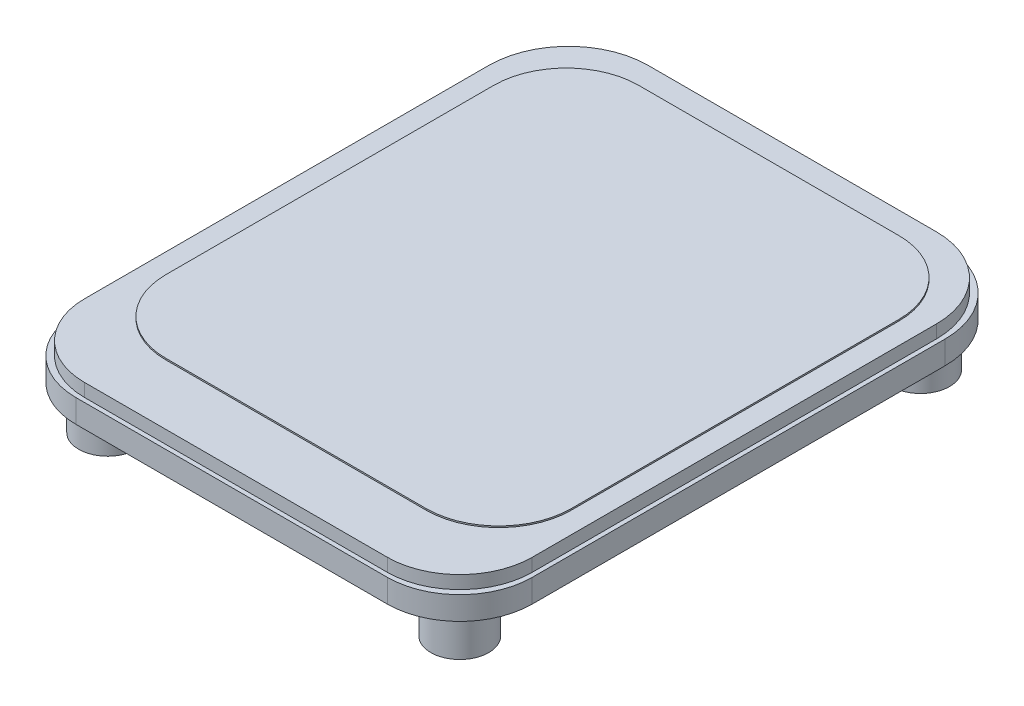
ISO-10303-21;
HEADER;
FILE_DESCRIPTION(('STEP AP214'),'2;1');
FILE_NAME('part.step','',(''),(''),'','','');
FILE_SCHEMA(('AUTOMOTIVE_DESIGN { 1 0 10303 214 1 1 1 1 }'));
ENDSEC;
DATA;
#1=APPLICATION_CONTEXT('core data for automotive mechanical design processes');
#2=APPLICATION_PROTOCOL_DEFINITION('international standard','automotive_design',2000,#1);
#3=PRODUCT_CONTEXT('',#1,'mechanical');
#4=PRODUCT('Part','Part','',(#3));
#5=PRODUCT_RELATED_PRODUCT_CATEGORY('part','',(#4));
#6=PRODUCT_DEFINITION_FORMATION('','',#4);
#7=PRODUCT_DEFINITION_CONTEXT('part definition',#1,'design');
#8=PRODUCT_DEFINITION('design','',#6,#7);
#9=PRODUCT_DEFINITION_SHAPE('','',#8);
#10=(LENGTH_UNIT() NAMED_UNIT(*) SI_UNIT(.MILLI.,.METRE.));
#11=(NAMED_UNIT(*) PLANE_ANGLE_UNIT() SI_UNIT($,.RADIAN.));
#12=(NAMED_UNIT(*) SI_UNIT($,.STERADIAN.) SOLID_ANGLE_UNIT());
#13=UNCERTAINTY_MEASURE_WITH_UNIT(LENGTH_MEASURE(1.E-05),#10,'distance_accuracy_value','');
#14=(GEOMETRIC_REPRESENTATION_CONTEXT(3) GLOBAL_UNCERTAINTY_ASSIGNED_CONTEXT((#13)) GLOBAL_UNIT_ASSIGNED_CONTEXT((#10,
#11,#12)) REPRESENTATION_CONTEXT('',''));
#15=CARTESIAN_POINT('',(0.,0.,0.));
#16=DIRECTION('',(0.,0.,1.));
#17=DIRECTION('',(1.,0.,0.));
#18=AXIS2_PLACEMENT_3D('',#15,#16,#17);
#19=CARTESIAN_POINT('',(10.25,1.6,-14.));
#20=DIRECTION('',(0.,-1.,0.));
#21=DIRECTION('',(0.,0.,-1.));
#22=AXIS2_PLACEMENT_3D('',#19,#20,#21);
#23=PLANE('',#22);
#24=CARTESIAN_POINT('',(10.25,1.6,-14.));
#25=DIRECTION('',(0.,1.,0.));
#26=DIRECTION('',(0.,0.,-1.));
#27=AXIS2_PLACEMENT_3D('',#24,#25,#26);
#28=CIRCLE('',#27,5.5);
#29=CARTESIAN_POINT('',(15.75,1.6,-14.));
#30=VERTEX_POINT('',#29);
#31=CARTESIAN_POINT('',(10.25,1.6,-19.5));
#32=VERTEX_POINT('',#31);
#33=EDGE_CURVE('E288',#30,#32,#28,.T.);
#34=ORIENTED_EDGE('',*,*,#33,.T.);
#35=DIRECTION('',(-1.,0.,0.));
#36=VECTOR('',#35,1.);
#37=CARTESIAN_POINT('',(-10.25,1.6,-19.5));
#38=LINE('',#37,#36);
#39=CARTESIAN_POINT('',(-10.25,1.6,-19.5));
#40=VERTEX_POINT('',#39);
#41=EDGE_CURVE('E291',#32,#40,#38,.T.);
#42=ORIENTED_EDGE('',*,*,#41,.T.);
#43=CARTESIAN_POINT('',(-10.25,1.6,-14.));
#44=DIRECTION('',(0.,1.,0.));
#45=DIRECTION('',(0.,0.,1.));
#46=AXIS2_PLACEMENT_3D('',#43,#44,#45);
#47=CIRCLE('',#46,5.5);
#48=CARTESIAN_POINT('',(-15.75,1.6,-14.));
#49=VERTEX_POINT('',#48);
#50=EDGE_CURVE('E294',#40,#49,#47,.T.);
#51=ORIENTED_EDGE('',*,*,#50,.T.);
#52=DIRECTION('',(0.,0.,1.));
#53=VECTOR('',#52,1.);
#54=CARTESIAN_POINT('',(-15.75,1.6,-14.));
#55=LINE('',#54,#53);
#56=CARTESIAN_POINT('',(-15.75,1.6,14.5));
#57=VERTEX_POINT('',#56);
#58=EDGE_CURVE('E296',#49,#57,#55,.T.);
#59=ORIENTED_EDGE('',*,*,#58,.T.);
#60=CARTESIAN_POINT('',(-10.75,1.6,14.5));
#61=DIRECTION('',(0.,1.,0.));
#62=DIRECTION('',(0.,0.,1.));
#63=AXIS2_PLACEMENT_3D('',#60,#61,#62);
#64=CIRCLE('',#63,5.);
#65=CARTESIAN_POINT('',(-10.75,1.6,19.5));
#66=VERTEX_POINT('',#65);
#67=EDGE_CURVE('E298',#57,#66,#64,.T.);
#68=ORIENTED_EDGE('',*,*,#67,.T.);
#69=DIRECTION('',(1.,0.,0.));
#70=VECTOR('',#69,1.);
#71=CARTESIAN_POINT('',(-10.75,1.6,19.5));
#72=LINE('',#71,#70);
#73=CARTESIAN_POINT('',(10.75,1.6,19.5));
#74=VERTEX_POINT('',#73);
#75=EDGE_CURVE('E300',#66,#74,#72,.T.);
#76=ORIENTED_EDGE('',*,*,#75,.T.);
#77=CARTESIAN_POINT('',(10.75,1.6,14.5));
#78=DIRECTION('',(0.,1.,0.));
#79=DIRECTION('',(0.,0.,1.));
#80=AXIS2_PLACEMENT_3D('',#77,#78,#79);
#81=CIRCLE('',#80,5.);
#82=CARTESIAN_POINT('',(15.75,1.6,14.5));
#83=VERTEX_POINT('',#82);
#84=EDGE_CURVE('E302',#74,#83,#81,.T.);
#85=ORIENTED_EDGE('',*,*,#84,.T.);
#86=DIRECTION('',(0.,0.,-1.));
#87=VECTOR('',#86,1.);
#88=CARTESIAN_POINT('',(15.75,1.6,-14.));
#89=LINE('',#88,#87);
#90=EDGE_CURVE('E304',#83,#30,#89,.T.);
#91=ORIENTED_EDGE('',*,*,#90,.T.);
#92=EDGE_LOOP('',(#34,#42,#51,#59,#68,#76,#85,#91));
#93=FACE_BOUND('',#92,.T.);
#94=CARTESIAN_POINT('',(10.45,1.6,14.2));
#95=DIRECTION('',(0.,1.,0.));
#96=DIRECTION('',(0.,0.,1.));
#97=AXIS2_PLACEMENT_3D('',#94,#95,#96);
#98=CIRCLE('',#97,5.);
#99=CARTESIAN_POINT('',(10.45,1.6,19.2));
#100=VERTEX_POINT('',#99);
#101=CARTESIAN_POINT('',(15.45,1.6,14.2));
#102=VERTEX_POINT('',#101);
#103=EDGE_CURVE('E219',#100,#102,#98,.T.);
#104=ORIENTED_EDGE('',*,*,#103,.F.);
#105=DIRECTION('',(1.,0.,0.));
#106=VECTOR('',#105,1.);
#107=CARTESIAN_POINT('',(-10.45,1.6,19.2));
#108=LINE('',#107,#106);
#109=CARTESIAN_POINT('',(-10.45,1.6,19.2));
#110=VERTEX_POINT('',#109);
#111=EDGE_CURVE('E216',#110,#100,#108,.T.);
#112=ORIENTED_EDGE('',*,*,#111,.F.);
#113=CARTESIAN_POINT('',(-10.45,1.6,14.2));
#114=DIRECTION('',(0.,1.,0.));
#115=DIRECTION('',(0.,0.,1.));
#116=AXIS2_PLACEMENT_3D('',#113,#114,#115);
#117=CIRCLE('',#116,5.);
#118=CARTESIAN_POINT('',(-15.45,1.6,14.2));
#119=VERTEX_POINT('',#118);
#120=EDGE_CURVE('E559',#119,#110,#117,.T.);
#121=ORIENTED_EDGE('',*,*,#120,.F.);
#122=DIRECTION('',(0.,0.,1.));
#123=VECTOR('',#122,1.);
#124=CARTESIAN_POINT('',(-15.45,1.6,-13.7));
#125=LINE('',#124,#123);
#126=CARTESIAN_POINT('',(-15.45,1.6,-13.7));
#127=VERTEX_POINT('',#126);
#128=EDGE_CURVE('E556',#127,#119,#125,.T.);
#129=ORIENTED_EDGE('',*,*,#128,.F.);
#130=CARTESIAN_POINT('',(-9.95,1.6,-13.7));
#131=DIRECTION('',(0.,1.,0.));
#132=DIRECTION('',(0.,0.,1.));
#133=AXIS2_PLACEMENT_3D('',#130,#131,#132);
#134=CIRCLE('',#133,5.5);
#135=CARTESIAN_POINT('',(-9.95,1.6,-19.2));
#136=VERTEX_POINT('',#135);
#137=EDGE_CURVE('E553',#136,#127,#134,.T.);
#138=ORIENTED_EDGE('',*,*,#137,.F.);
#139=DIRECTION('',(-1.,0.,0.));
#140=VECTOR('',#139,1.);
#141=CARTESIAN_POINT('',(-9.94999999999997,1.6,-19.2));
#142=LINE('',#141,#140);
#143=CARTESIAN_POINT('',(9.94999999999996,1.6,-19.2));
#144=VERTEX_POINT('',#143);
#145=EDGE_CURVE('E550',#144,#136,#142,.T.);
#146=ORIENTED_EDGE('',*,*,#145,.F.);
#147=CARTESIAN_POINT('',(9.95,1.6,-13.7));
#148=DIRECTION('',(0.,1.,0.));
#149=DIRECTION('',(0.,0.,-1.));
#150=AXIS2_PLACEMENT_3D('',#147,#148,#149);
#151=CIRCLE('',#150,5.5);
#152=CARTESIAN_POINT('',(15.45,1.6,-13.7));
#153=VERTEX_POINT('',#152);
#154=EDGE_CURVE('E57',#153,#144,#151,.T.);
#155=ORIENTED_EDGE('',*,*,#154,.F.);
#156=DIRECTION('',(0.,0.,-1.));
#157=VECTOR('',#156,1.);
#158=CARTESIAN_POINT('',(15.45,1.6,-13.7));
#159=LINE('',#158,#157);
#160=EDGE_CURVE('E52',#102,#153,#159,.T.);
#161=ORIENTED_EDGE('',*,*,#160,.F.);
#162=EDGE_LOOP('',(#104,#112,#121,#129,#138,#146,#155,#161));
#163=FACE_BOUND('',#162,.T.);
#164=ADVANCED_FACE('F37',(#93,#163),#23,.F.);
#165=CARTESIAN_POINT('',(10.25,1.6,-14.));
#166=DIRECTION('',(0.,-1.,0.));
#167=DIRECTION('',(0.,0.,-1.));
#168=AXIS2_PLACEMENT_3D('',#165,#166,#167);
#169=CYLINDRICAL_SURFACE('',#168,5.5);
#170=CARTESIAN_POINT('',(10.25,0.,-14.));
#171=DIRECTION('',(0.,1.,0.));
#172=DIRECTION('',(0.,0.,-1.));
#173=AXIS2_PLACEMENT_3D('',#170,#171,#172);
#174=CIRCLE('',#173,5.5);
#175=CARTESIAN_POINT('',(15.75,0.,-14.));
#176=VERTEX_POINT('',#175);
#177=CARTESIAN_POINT('',(10.25,0.,-19.5));
#178=VERTEX_POINT('',#177);
#179=EDGE_CURVE('E287',#176,#178,#174,.T.);
#180=ORIENTED_EDGE('',*,*,#179,.T.);
#181=DIRECTION('',(0.,-1.,0.));
#182=VECTOR('',#181,1.);
#183=CARTESIAN_POINT('',(10.25,1.6,-19.5));
#184=LINE('',#183,#182);
#185=EDGE_CURVE('E342',#32,#178,#184,.T.);
#186=ORIENTED_EDGE('',*,*,#185,.F.);
#187=ORIENTED_EDGE('',*,*,#33,.F.);
#188=DIRECTION('',(0.,-1.,0.));
#189=VECTOR('',#188,1.);
#190=CARTESIAN_POINT('',(15.75,1.6,-14.));
#191=LINE('',#190,#189);
#192=EDGE_CURVE('E306',#30,#176,#191,.T.);
#193=ORIENTED_EDGE('',*,*,#192,.T.);
#194=EDGE_LOOP('',(#180,#186,#187,#193));
#195=FACE_BOUND('',#194,.T.);
#196=ADVANCED_FACE('F39',(#195),#169,.T.);
#197=CARTESIAN_POINT('',(-10.25,1.6,-19.5));
#198=DIRECTION('',(0.,0.,1.));
#199=DIRECTION('',(1.,0.,0.));
#200=AXIS2_PLACEMENT_3D('',#197,#198,#199);
#201=PLANE('',#200);
#202=DIRECTION('',(-1.,0.,0.));
#203=VECTOR('',#202,1.);
#204=CARTESIAN_POINT('',(-10.25,0.,-19.5));
#205=LINE('',#204,#203);
#206=CARTESIAN_POINT('',(-10.25,0.,-19.5));
#207=VERTEX_POINT('',#206);
#208=EDGE_CURVE('E309',#178,#207,#205,.T.);
#209=ORIENTED_EDGE('',*,*,#208,.T.);
#210=DIRECTION('',(0.,-1.,0.));
#211=VECTOR('',#210,1.);
#212=CARTESIAN_POINT('',(-10.25,1.6,-19.5));
#213=LINE('',#212,#211);
#214=EDGE_CURVE('E339',#40,#207,#213,.T.);
#215=ORIENTED_EDGE('',*,*,#214,.F.);
#216=ORIENTED_EDGE('',*,*,#41,.F.);
#217=ORIENTED_EDGE('',*,*,#185,.T.);
#218=EDGE_LOOP('',(#209,#215,#216,#217));
#219=FACE_BOUND('',#218,.T.);
#220=ADVANCED_FACE('F390',(#219),#201,.F.);
#221=CARTESIAN_POINT('',(-10.25,1.6,-14.));
#222=DIRECTION('',(0.,-1.,0.));
#223=DIRECTION('',(0.,0.,-1.));
#224=AXIS2_PLACEMENT_3D('',#221,#222,#223);
#225=CYLINDRICAL_SURFACE('',#224,5.5);
#226=CARTESIAN_POINT('',(-10.25,0.,-14.));
#227=DIRECTION('',(0.,1.,0.));
#228=DIRECTION('',(0.,0.,1.));
#229=AXIS2_PLACEMENT_3D('',#226,#227,#228);
#230=CIRCLE('',#229,5.5);
#231=CARTESIAN_POINT('',(-15.75,0.,-14.));
#232=VERTEX_POINT('',#231);
#233=EDGE_CURVE('E311',#207,#232,#230,.T.);
#234=ORIENTED_EDGE('',*,*,#233,.T.);
#235=DIRECTION('',(0.,-1.,0.));
#236=VECTOR('',#235,1.);
#237=CARTESIAN_POINT('',(-15.75,1.6,-14.));
#238=LINE('',#237,#236);
#239=EDGE_CURVE('E336',#49,#232,#238,.T.);
#240=ORIENTED_EDGE('',*,*,#239,.F.);
#241=ORIENTED_EDGE('',*,*,#50,.F.);
#242=ORIENTED_EDGE('',*,*,#214,.T.);
#243=EDGE_LOOP('',(#234,#240,#241,#242));
#244=FACE_BOUND('',#243,.T.);
#245=ADVANCED_FACE('F623',(#244),#225,.T.);
#246=CARTESIAN_POINT('',(-15.75,1.6,-14.));
#247=DIRECTION('',(1.,0.,0.));
#248=DIRECTION('',(0.,0.,-1.));
#249=AXIS2_PLACEMENT_3D('',#246,#247,#248);
#250=PLANE('',#249);
#251=DIRECTION('',(0.,0.,1.));
#252=VECTOR('',#251,1.);
#253=CARTESIAN_POINT('',(-15.75,0.,-14.));
#254=LINE('',#253,#252);
#255=CARTESIAN_POINT('',(-15.75,0.,14.5));
#256=VERTEX_POINT('',#255);
#257=EDGE_CURVE('E313',#232,#256,#254,.T.);
#258=ORIENTED_EDGE('',*,*,#257,.T.);
#259=DIRECTION('',(0.,-1.,0.));
#260=VECTOR('',#259,1.);
#261=CARTESIAN_POINT('',(-15.75,1.6,14.5));
#262=LINE('',#261,#260);
#263=EDGE_CURVE('E333',#57,#256,#262,.T.);
#264=ORIENTED_EDGE('',*,*,#263,.F.);
#265=ORIENTED_EDGE('',*,*,#58,.F.);
#266=ORIENTED_EDGE('',*,*,#239,.T.);
#267=EDGE_LOOP('',(#258,#264,#265,#266));
#268=FACE_BOUND('',#267,.T.);
#269=ADVANCED_FACE('F620',(#268),#250,.F.);
#270=CARTESIAN_POINT('',(-10.75,1.6,14.5));
#271=DIRECTION('',(0.,-1.,0.));
#272=DIRECTION('',(0.,0.,-1.));
#273=AXIS2_PLACEMENT_3D('',#270,#271,#272);
#274=CYLINDRICAL_SURFACE('',#273,5.);
#275=CARTESIAN_POINT('',(-10.75,0.,14.5));
#276=DIRECTION('',(0.,1.,0.));
#277=DIRECTION('',(0.,0.,1.));
#278=AXIS2_PLACEMENT_3D('',#275,#276,#277);
#279=CIRCLE('',#278,5.);
#280=CARTESIAN_POINT('',(-10.75,0.,19.5));
#281=VERTEX_POINT('',#280);
#282=EDGE_CURVE('E315',#256,#281,#279,.T.);
#283=ORIENTED_EDGE('',*,*,#282,.T.);
#284=DIRECTION('',(0.,-1.,0.));
#285=VECTOR('',#284,1.);
#286=CARTESIAN_POINT('',(-10.75,1.6,19.5));
#287=LINE('',#286,#285);
#288=EDGE_CURVE('E330',#66,#281,#287,.T.);
#289=ORIENTED_EDGE('',*,*,#288,.F.);
#290=ORIENTED_EDGE('',*,*,#67,.F.);
#291=ORIENTED_EDGE('',*,*,#263,.T.);
#292=EDGE_LOOP('',(#283,#289,#290,#291));
#293=FACE_BOUND('',#292,.T.);
#294=ADVANCED_FACE('F616',(#293),#274,.T.);
#295=CARTESIAN_POINT('',(-10.75,1.6,19.5));
#296=DIRECTION('',(0.,0.,-1.));
#297=DIRECTION('',(-1.,0.,0.));
#298=AXIS2_PLACEMENT_3D('',#295,#296,#297);
#299=PLANE('',#298);
#300=DIRECTION('',(1.,0.,0.));
#301=VECTOR('',#300,1.);
#302=CARTESIAN_POINT('',(-10.75,0.,19.5));
#303=LINE('',#302,#301);
#304=CARTESIAN_POINT('',(10.75,0.,19.5));
#305=VERTEX_POINT('',#304);
#306=EDGE_CURVE('E317',#281,#305,#303,.T.);
#307=ORIENTED_EDGE('',*,*,#306,.T.);
#308=DIRECTION('',(0.,-1.,0.));
#309=VECTOR('',#308,1.);
#310=CARTESIAN_POINT('',(10.75,1.6,19.5));
#311=LINE('',#310,#309);
#312=EDGE_CURVE('E327',#74,#305,#311,.T.);
#313=ORIENTED_EDGE('',*,*,#312,.F.);
#314=ORIENTED_EDGE('',*,*,#75,.F.);
#315=ORIENTED_EDGE('',*,*,#288,.T.);
#316=EDGE_LOOP('',(#307,#313,#314,#315));
#317=FACE_BOUND('',#316,.T.);
#318=ADVANCED_FACE('F611',(#317),#299,.F.);
#319=CARTESIAN_POINT('',(10.75,1.6,14.5));
#320=DIRECTION('',(0.,-1.,0.));
#321=DIRECTION('',(0.,0.,-1.));
#322=AXIS2_PLACEMENT_3D('',#319,#320,#321);
#323=CYLINDRICAL_SURFACE('',#322,5.);
#324=CARTESIAN_POINT('',(10.75,0.,14.5));
#325=DIRECTION('',(0.,1.,0.));
#326=DIRECTION('',(0.,0.,1.));
#327=AXIS2_PLACEMENT_3D('',#324,#325,#326);
#328=CIRCLE('',#327,5.);
#329=CARTESIAN_POINT('',(15.75,0.,14.5));
#330=VERTEX_POINT('',#329);
#331=EDGE_CURVE('E319',#305,#330,#328,.T.);
#332=ORIENTED_EDGE('',*,*,#331,.T.);
#333=DIRECTION('',(0.,-1.,0.));
#334=VECTOR('',#333,1.);
#335=CARTESIAN_POINT('',(15.75,1.6,14.5));
#336=LINE('',#335,#334);
#337=EDGE_CURVE('E324',#83,#330,#336,.T.);
#338=ORIENTED_EDGE('',*,*,#337,.F.);
#339=ORIENTED_EDGE('',*,*,#84,.F.);
#340=ORIENTED_EDGE('',*,*,#312,.T.);
#341=EDGE_LOOP('',(#332,#338,#339,#340));
#342=FACE_BOUND('',#341,.T.);
#343=ADVANCED_FACE('F605',(#342),#323,.T.);
#344=CARTESIAN_POINT('',(15.75,1.6,-14.));
#345=DIRECTION('',(-1.,0.,0.));
#346=DIRECTION('',(0.,0.,1.));
#347=AXIS2_PLACEMENT_3D('',#344,#345,#346);
#348=PLANE('',#347);
#349=DIRECTION('',(0.,0.,-1.));
#350=VECTOR('',#349,1.);
#351=CARTESIAN_POINT('',(15.75,0.,-14.));
#352=LINE('',#351,#350);
#353=EDGE_CURVE('E292',#330,#176,#352,.T.);
#354=ORIENTED_EDGE('',*,*,#353,.T.);
#355=ORIENTED_EDGE('',*,*,#192,.F.);
#356=ORIENTED_EDGE('',*,*,#90,.F.);
#357=ORIENTED_EDGE('',*,*,#337,.T.);
#358=EDGE_LOOP('',(#354,#355,#356,#357));
#359=FACE_BOUND('',#358,.T.);
#360=ADVANCED_FACE('F591',(#359),#348,.F.);
#361=CARTESIAN_POINT('',(10.25,0.,-14.));
#362=DIRECTION('',(0.,-1.,0.));
#363=DIRECTION('',(0.,0.,-1.));
#364=AXIS2_PLACEMENT_3D('',#361,#362,#363);
#365=PLANE('',#364);
#366=CARTESIAN_POINT('',(-12.15,0.,-15.9));
#367=DIRECTION('',(0.,-1.,0.));
#368=DIRECTION('',(0.,0.,-1.));
#369=AXIS2_PLACEMENT_3D('',#366,#367,#368);
#370=CIRCLE('',#369,2.);
#371=CARTESIAN_POINT('',(-12.15,0.,-17.9));
#372=VERTEX_POINT('',#371);
#373=EDGE_CURVE('E501',#372,#372,#370,.T.);
#374=ORIENTED_EDGE('',*,*,#373,.F.);
#375=EDGE_LOOP('',(#374));
#376=FACE_BOUND('',#375,.T.);
#377=CARTESIAN_POINT('',(12.15,0.,-15.9));
#378=DIRECTION('',(0.,-1.,0.));
#379=DIRECTION('',(0.,0.,-1.));
#380=AXIS2_PLACEMENT_3D('',#377,#378,#379);
#381=CIRCLE('',#380,2.);
#382=CARTESIAN_POINT('',(12.15,0.,-17.9));
#383=VERTEX_POINT('',#382);
#384=EDGE_CURVE('E512',#383,#383,#381,.T.);
#385=ORIENTED_EDGE('',*,*,#384,.F.);
#386=EDGE_LOOP('',(#385));
#387=FACE_BOUND('',#386,.T.);
#388=CARTESIAN_POINT('',(12.15,0.,15.9));
#389=DIRECTION('',(0.,-1.,0.));
#390=DIRECTION('',(0.,0.,-1.));
#391=AXIS2_PLACEMENT_3D('',#388,#389,#390);
#392=CIRCLE('',#391,2.);
#393=CARTESIAN_POINT('',(12.15,0.,13.9));
#394=VERTEX_POINT('',#393);
#395=EDGE_CURVE('E521',#394,#394,#392,.T.);
#396=ORIENTED_EDGE('',*,*,#395,.F.);
#397=EDGE_LOOP('',(#396));
#398=FACE_BOUND('',#397,.T.);
#399=CARTESIAN_POINT('',(-12.15,0.,15.9));
#400=DIRECTION('',(0.,-1.,0.));
#401=DIRECTION('',(0.,0.,-1.));
#402=AXIS2_PLACEMENT_3D('',#399,#400,#401);
#403=CIRCLE('',#402,2.);
#404=CARTESIAN_POINT('',(-12.15,0.,13.9));
#405=VERTEX_POINT('',#404);
#406=EDGE_CURVE('E530',#405,#405,#403,.T.);
#407=ORIENTED_EDGE('',*,*,#406,.F.);
#408=EDGE_LOOP('',(#407));
#409=FACE_BOUND('',#408,.T.);
#410=ORIENTED_EDGE('',*,*,#179,.F.);
#411=ORIENTED_EDGE('',*,*,#353,.F.);
#412=ORIENTED_EDGE('',*,*,#331,.F.);
#413=ORIENTED_EDGE('',*,*,#306,.F.);
#414=ORIENTED_EDGE('',*,*,#282,.F.);
#415=ORIENTED_EDGE('',*,*,#257,.F.);
#416=ORIENTED_EDGE('',*,*,#233,.F.);
#417=ORIENTED_EDGE('',*,*,#208,.F.);
#418=EDGE_LOOP('',(#410,#411,#412,#413,#414,#415,#416,#417));
#419=FACE_BOUND('',#418,.T.);
#420=ADVANCED_FACE('F374',(#376,#387,#398,#409,#419),#365,.T.);
#421=CARTESIAN_POINT('',(10.45,2.5,14.2));
#422=DIRECTION('',(0.,1.,0.));
#423=DIRECTION('',(0.,0.,1.));
#424=AXIS2_PLACEMENT_3D('',#421,#422,#423);
#425=PLANE('',#424);
#426=CARTESIAN_POINT('',(10.45,2.5,14.2));
#427=DIRECTION('',(0.,1.,0.));
#428=DIRECTION('',(0.,0.,1.));
#429=AXIS2_PLACEMENT_3D('',#426,#427,#428);
#430=CIRCLE('',#429,5.);
#431=CARTESIAN_POINT('',(10.45,2.5,19.2));
#432=VERTEX_POINT('',#431);
#433=CARTESIAN_POINT('',(15.45,2.5,14.2));
#434=VERTEX_POINT('',#433);
#435=EDGE_CURVE('E206',#432,#434,#430,.T.);
#436=ORIENTED_EDGE('',*,*,#435,.T.);
#437=DIRECTION('',(0.,0.,-1.));
#438=VECTOR('',#437,1.);
#439=CARTESIAN_POINT('',(15.45,2.5,-13.7));
#440=LINE('',#439,#438);
#441=CARTESIAN_POINT('',(15.45,2.5,-13.7));
#442=VERTEX_POINT('',#441);
#443=EDGE_CURVE('E195',#434,#442,#440,.T.);
#444=ORIENTED_EDGE('',*,*,#443,.T.);
#445=CARTESIAN_POINT('',(9.95,2.5,-13.7));
#446=DIRECTION('',(0.,1.,0.));
#447=DIRECTION('',(0.,0.,-1.));
#448=AXIS2_PLACEMENT_3D('',#445,#446,#447);
#449=CIRCLE('',#448,5.5);
#450=CARTESIAN_POINT('',(9.94999999999996,2.5,-19.2));
#451=VERTEX_POINT('',#450);
#452=EDGE_CURVE('E205',#442,#451,#449,.T.);
#453=ORIENTED_EDGE('',*,*,#452,.T.);
#454=DIRECTION('',(-1.,0.,0.));
#455=VECTOR('',#454,1.);
#456=CARTESIAN_POINT('',(-9.94999999999997,2.5,-19.2));
#457=LINE('',#456,#455);
#458=CARTESIAN_POINT('',(-9.94999999999997,2.5,-19.2));
#459=VERTEX_POINT('',#458);
#460=EDGE_CURVE('E537',#451,#459,#457,.T.);
#461=ORIENTED_EDGE('',*,*,#460,.T.);
#462=CARTESIAN_POINT('',(-9.95,2.5,-13.7));
#463=DIRECTION('',(0.,1.,0.));
#464=DIRECTION('',(0.,0.,1.));
#465=AXIS2_PLACEMENT_3D('',#462,#463,#464);
#466=CIRCLE('',#465,5.5);
#467=CARTESIAN_POINT('',(-15.45,2.5,-13.7));
#468=VERTEX_POINT('',#467);
#469=EDGE_CURVE('E539',#459,#468,#466,.T.);
#470=ORIENTED_EDGE('',*,*,#469,.T.);
#471=DIRECTION('',(0.,0.,1.));
#472=VECTOR('',#471,1.);
#473=CARTESIAN_POINT('',(-15.45,2.5,-13.7));
#474=LINE('',#473,#472);
#475=CARTESIAN_POINT('',(-15.45,2.5,14.2));
#476=VERTEX_POINT('',#475);
#477=EDGE_CURVE('E541',#468,#476,#474,.T.);
#478=ORIENTED_EDGE('',*,*,#477,.T.);
#479=CARTESIAN_POINT('',(-10.45,2.5,14.2));
#480=DIRECTION('',(0.,1.,0.));
#481=DIRECTION('',(0.,0.,1.));
#482=AXIS2_PLACEMENT_3D('',#479,#480,#481);
#483=CIRCLE('',#482,5.);
#484=CARTESIAN_POINT('',(-10.45,2.5,19.2));
#485=VERTEX_POINT('',#484);
#486=EDGE_CURVE('E543',#476,#485,#483,.T.);
#487=ORIENTED_EDGE('',*,*,#486,.T.);
#488=DIRECTION('',(1.,0.,0.));
#489=VECTOR('',#488,1.);
#490=CARTESIAN_POINT('',(-10.45,2.5,19.2));
#491=LINE('',#490,#489);
#492=EDGE_CURVE('E212',#485,#432,#491,.T.);
#493=ORIENTED_EDGE('',*,*,#492,.T.);
#494=EDGE_LOOP('',(#436,#444,#453,#461,#470,#478,#487,#493));
#495=FACE_BOUND('',#494,.T.);
#496=CARTESIAN_POINT('',(-8.98499999999999,2.5,10.05));
#497=DIRECTION('',(0.,1.,0.));
#498=DIRECTION('',(0.,0.,1.));
#499=AXIS2_PLACEMENT_3D('',#496,#497,#498);
#500=CIRCLE('',#499,5.);
#501=CARTESIAN_POINT('',(-13.985,2.5,10.05));
#502=VERTEX_POINT('',#501);
#503=CARTESIAN_POINT('',(-8.98499999999999,2.5,15.05));
#504=VERTEX_POINT('',#503);
#505=EDGE_CURVE('E243',#502,#504,#500,.T.);
#506=ORIENTED_EDGE('',*,*,#505,.F.);
#507=DIRECTION('',(0.,0.,1.));
#508=VECTOR('',#507,1.);
#509=CARTESIAN_POINT('',(-13.985,2.5,-12.58));
#510=LINE('',#509,#508);
#511=CARTESIAN_POINT('',(-13.985,2.5,-12.58));
#512=VERTEX_POINT('',#511);
#513=EDGE_CURVE('E345',#512,#502,#510,.T.);
#514=ORIENTED_EDGE('',*,*,#513,.F.);
#515=CARTESIAN_POINT('',(-8.985,2.5,-12.58));
#516=DIRECTION('',(0.,1.,0.));
#517=DIRECTION('',(0.,0.,1.));
#518=AXIS2_PLACEMENT_3D('',#515,#516,#517);
#519=CIRCLE('',#518,5.);
#520=CARTESIAN_POINT('',(-8.985,2.5,-17.58));
#521=VERTEX_POINT('',#520);
#522=EDGE_CURVE('E220',#521,#512,#519,.T.);
#523=ORIENTED_EDGE('',*,*,#522,.F.);
#524=DIRECTION('',(-1.,0.,0.));
#525=VECTOR('',#524,1.);
#526=CARTESIAN_POINT('',(-8.985,2.5,-17.58));
#527=LINE('',#526,#525);
#528=CARTESIAN_POINT('',(8.985,2.5,-17.58));
#529=VERTEX_POINT('',#528);
#530=EDGE_CURVE('E223',#529,#521,#527,.T.);
#531=ORIENTED_EDGE('',*,*,#530,.F.);
#532=CARTESIAN_POINT('',(8.985,2.5,-12.58));
#533=DIRECTION('',(0.,1.,0.));
#534=DIRECTION('',(0.,0.,1.));
#535=AXIS2_PLACEMENT_3D('',#532,#533,#534);
#536=CIRCLE('',#535,5.);
#537=CARTESIAN_POINT('',(13.985,2.5,-12.58));
#538=VERTEX_POINT('',#537);
#539=EDGE_CURVE('E231',#538,#529,#536,.T.);
#540=ORIENTED_EDGE('',*,*,#539,.F.);
#541=DIRECTION('',(0.,0.,-1.));
#542=VECTOR('',#541,1.);
#543=CARTESIAN_POINT('',(13.985,2.5,-12.58));
#544=LINE('',#543,#542);
#545=CARTESIAN_POINT('',(13.985,2.5,10.05));
#546=VERTEX_POINT('',#545);
#547=EDGE_CURVE('E234',#546,#538,#544,.T.);
#548=ORIENTED_EDGE('',*,*,#547,.F.);
#549=CARTESIAN_POINT('',(8.985,2.5,10.05));
#550=DIRECTION('',(0.,1.,0.));
#551=DIRECTION('',(0.,0.,1.));
#552=AXIS2_PLACEMENT_3D('',#549,#550,#551);
#553=CIRCLE('',#552,5.);
#554=CARTESIAN_POINT('',(8.985,2.5,15.05));
#555=VERTEX_POINT('',#554);
#556=EDGE_CURVE('E237',#555,#546,#553,.T.);
#557=ORIENTED_EDGE('',*,*,#556,.F.);
#558=DIRECTION('',(1.,0.,0.));
#559=VECTOR('',#558,1.);
#560=CARTESIAN_POINT('',(-8.98499999999999,2.5,15.05));
#561=LINE('',#560,#559);
#562=EDGE_CURVE('E240',#504,#555,#561,.T.);
#563=ORIENTED_EDGE('',*,*,#562,.F.);
#564=EDGE_LOOP('',(#506,#514,#523,#531,#540,#548,#557,#563));
#565=FACE_BOUND('',#564,.T.);
#566=ADVANCED_FACE('F209',(#495,#565),#425,.T.);
#567=CARTESIAN_POINT('',(10.45,2.5,14.2));
#568=DIRECTION('',(0.,-1.,0.));
#569=DIRECTION('',(0.,0.,-1.));
#570=AXIS2_PLACEMENT_3D('',#567,#568,#569);
#571=CYLINDRICAL_SURFACE('',#570,5.);
#572=ORIENTED_EDGE('',*,*,#103,.T.);
#573=DIRECTION('',(0.,-1.,0.));
#574=VECTOR('',#573,1.);
#575=CARTESIAN_POINT('',(15.45,2.5,14.2));
#576=LINE('',#575,#574);
#577=EDGE_CURVE('E199',#434,#102,#576,.T.);
#578=ORIENTED_EDGE('',*,*,#577,.F.);
#579=ORIENTED_EDGE('',*,*,#435,.F.);
#580=DIRECTION('',(0.,-1.,0.));
#581=VECTOR('',#580,1.);
#582=CARTESIAN_POINT('',(10.45,2.5,19.2));
#583=LINE('',#582,#581);
#584=EDGE_CURVE('E546',#432,#100,#583,.T.);
#585=ORIENTED_EDGE('',*,*,#584,.T.);
#586=EDGE_LOOP('',(#572,#578,#579,#585));
#587=FACE_BOUND('',#586,.T.);
#588=ADVANCED_FACE('F218',(#587),#571,.T.);
#589=CARTESIAN_POINT('',(15.45,2.5,-13.7));
#590=DIRECTION('',(-1.,0.,0.));
#591=DIRECTION('',(0.,0.,1.));
#592=AXIS2_PLACEMENT_3D('',#589,#590,#591);
#593=PLANE('',#592);
#594=ORIENTED_EDGE('',*,*,#160,.T.);
#595=DIRECTION('',(0.,-1.,0.));
#596=VECTOR('',#595,1.);
#597=CARTESIAN_POINT('',(15.45,2.5,-13.7));
#598=LINE('',#597,#596);
#599=EDGE_CURVE('E202',#442,#153,#598,.T.);
#600=ORIENTED_EDGE('',*,*,#599,.F.);
#601=ORIENTED_EDGE('',*,*,#443,.F.);
#602=ORIENTED_EDGE('',*,*,#577,.T.);
#603=EDGE_LOOP('',(#594,#600,#601,#602));
#604=FACE_BOUND('',#603,.T.);
#605=ADVANCED_FACE('F197',(#604),#593,.F.);
#606=CARTESIAN_POINT('',(9.95,2.5,-13.7));
#607=DIRECTION('',(0.,-1.,0.));
#608=DIRECTION('',(0.,0.,-1.));
#609=AXIS2_PLACEMENT_3D('',#606,#607,#608);
#610=CYLINDRICAL_SURFACE('',#609,5.5);
#611=ORIENTED_EDGE('',*,*,#154,.T.);
#612=DIRECTION('',(0.,-1.,0.));
#613=VECTOR('',#612,1.);
#614=CARTESIAN_POINT('',(9.94999999999996,2.5,-19.2));
#615=LINE('',#614,#613);
#616=EDGE_CURVE('E225',#451,#144,#615,.T.);
#617=ORIENTED_EDGE('',*,*,#616,.F.);
#618=ORIENTED_EDGE('',*,*,#452,.F.);
#619=ORIENTED_EDGE('',*,*,#599,.T.);
#620=EDGE_LOOP('',(#611,#617,#618,#619));
#621=FACE_BOUND('',#620,.T.);
#622=ADVANCED_FACE('F435',(#621),#610,.T.);
#623=CARTESIAN_POINT('',(-9.94999999999997,2.5,-19.2));
#624=DIRECTION('',(0.,0.,1.));
#625=DIRECTION('',(1.,0.,0.));
#626=AXIS2_PLACEMENT_3D('',#623,#624,#625);
#627=PLANE('',#626);
#628=ORIENTED_EDGE('',*,*,#145,.T.);
#629=DIRECTION('',(0.,-1.,0.));
#630=VECTOR('',#629,1.);
#631=CARTESIAN_POINT('',(-9.94999999999997,2.5,-19.2));
#632=LINE('',#631,#630);
#633=EDGE_CURVE('E574',#459,#136,#632,.T.);
#634=ORIENTED_EDGE('',*,*,#633,.F.);
#635=ORIENTED_EDGE('',*,*,#460,.F.);
#636=ORIENTED_EDGE('',*,*,#616,.T.);
#637=EDGE_LOOP('',(#628,#634,#635,#636));
#638=FACE_BOUND('',#637,.T.);
#639=ADVANCED_FACE('F438',(#638),#627,.F.);
#640=CARTESIAN_POINT('',(-9.95,2.5,-13.7));
#641=DIRECTION('',(0.,-1.,0.));
#642=DIRECTION('',(0.,0.,-1.));
#643=AXIS2_PLACEMENT_3D('',#640,#641,#642);
#644=CYLINDRICAL_SURFACE('',#643,5.5);
#645=ORIENTED_EDGE('',*,*,#137,.T.);
#646=DIRECTION('',(0.,-1.,0.));
#647=VECTOR('',#646,1.);
#648=CARTESIAN_POINT('',(-15.45,2.5,-13.7));
#649=LINE('',#648,#647);
#650=EDGE_CURVE('E571',#468,#127,#649,.T.);
#651=ORIENTED_EDGE('',*,*,#650,.F.);
#652=ORIENTED_EDGE('',*,*,#469,.F.);
#653=ORIENTED_EDGE('',*,*,#633,.T.);
#654=EDGE_LOOP('',(#645,#651,#652,#653));
#655=FACE_BOUND('',#654,.T.);
#656=ADVANCED_FACE('F442',(#655),#644,.T.);
#657=CARTESIAN_POINT('',(-15.45,2.5,-13.7));
#658=DIRECTION('',(1.,0.,0.));
#659=DIRECTION('',(0.,0.,-1.));
#660=AXIS2_PLACEMENT_3D('',#657,#658,#659);
#661=PLANE('',#660);
#662=ORIENTED_EDGE('',*,*,#128,.T.);
#663=DIRECTION('',(0.,-1.,0.));
#664=VECTOR('',#663,1.);
#665=CARTESIAN_POINT('',(-15.45,2.5,14.2));
#666=LINE('',#665,#664);
#667=EDGE_CURVE('E568',#476,#119,#666,.T.);
#668=ORIENTED_EDGE('',*,*,#667,.F.);
#669=ORIENTED_EDGE('',*,*,#477,.F.);
#670=ORIENTED_EDGE('',*,*,#650,.T.);
#671=EDGE_LOOP('',(#662,#668,#669,#670));
#672=FACE_BOUND('',#671,.T.);
#673=ADVANCED_FACE('F446',(#672),#661,.F.);
#674=CARTESIAN_POINT('',(-10.45,2.5,14.2));
#675=DIRECTION('',(0.,-1.,0.));
#676=DIRECTION('',(0.,0.,-1.));
#677=AXIS2_PLACEMENT_3D('',#674,#675,#676);
#678=CYLINDRICAL_SURFACE('',#677,5.);
#679=ORIENTED_EDGE('',*,*,#120,.T.);
#680=DIRECTION('',(0.,-1.,0.));
#681=VECTOR('',#680,1.);
#682=CARTESIAN_POINT('',(-10.45,2.5,19.2));
#683=LINE('',#682,#681);
#684=EDGE_CURVE('E565',#485,#110,#683,.T.);
#685=ORIENTED_EDGE('',*,*,#684,.F.);
#686=ORIENTED_EDGE('',*,*,#486,.F.);
#687=ORIENTED_EDGE('',*,*,#667,.T.);
#688=EDGE_LOOP('',(#679,#685,#686,#687));
#689=FACE_BOUND('',#688,.T.);
#690=ADVANCED_FACE('F450',(#689),#678,.T.);
#691=CARTESIAN_POINT('',(-10.45,2.5,19.2));
#692=DIRECTION('',(0.,0.,-1.));
#693=DIRECTION('',(-1.,0.,0.));
#694=AXIS2_PLACEMENT_3D('',#691,#692,#693);
#695=PLANE('',#694);
#696=ORIENTED_EDGE('',*,*,#111,.T.);
#697=ORIENTED_EDGE('',*,*,#584,.F.);
#698=ORIENTED_EDGE('',*,*,#492,.F.);
#699=ORIENTED_EDGE('',*,*,#684,.T.);
#700=EDGE_LOOP('',(#696,#697,#698,#699));
#701=FACE_BOUND('',#700,.T.);
#702=ADVANCED_FACE('F429',(#701),#695,.F.);
#703=CARTESIAN_POINT('',(-8.98499999999999,2.6,10.05));
#704=DIRECTION('',(0.,1.,0.));
#705=DIRECTION('',(0.,0.,1.));
#706=AXIS2_PLACEMENT_3D('',#703,#704,#705);
#707=PLANE('',#706);
#708=CARTESIAN_POINT('',(-8.98499999999999,2.6,10.05));
#709=DIRECTION('',(0.,1.,0.));
#710=DIRECTION('',(0.,0.,1.));
#711=AXIS2_PLACEMENT_3D('',#708,#709,#710);
#712=CIRCLE('',#711,5.);
#713=CARTESIAN_POINT('',(-13.985,2.6,10.05));
#714=VERTEX_POINT('',#713);
#715=CARTESIAN_POINT('',(-8.98499999999999,2.6,15.05));
#716=VERTEX_POINT('',#715);
#717=EDGE_CURVE('E246',#714,#716,#712,.T.);
#718=ORIENTED_EDGE('',*,*,#717,.T.);
#719=DIRECTION('',(1.,0.,0.));
#720=VECTOR('',#719,1.);
#721=CARTESIAN_POINT('',(-8.98499999999999,2.6,15.05));
#722=LINE('',#721,#720);
#723=CARTESIAN_POINT('',(8.985,2.6,15.05));
#724=VERTEX_POINT('',#723);
#725=EDGE_CURVE('E249',#716,#724,#722,.T.);
#726=ORIENTED_EDGE('',*,*,#725,.T.);
#727=CARTESIAN_POINT('',(8.985,2.6,10.05));
#728=DIRECTION('',(0.,1.,0.));
#729=DIRECTION('',(0.,0.,1.));
#730=AXIS2_PLACEMENT_3D('',#727,#728,#729);
#731=CIRCLE('',#730,5.);
#732=CARTESIAN_POINT('',(13.985,2.6,10.05));
#733=VERTEX_POINT('',#732);
#734=EDGE_CURVE('E251',#724,#733,#731,.T.);
#735=ORIENTED_EDGE('',*,*,#734,.T.);
#736=DIRECTION('',(0.,0.,-1.));
#737=VECTOR('',#736,1.);
#738=CARTESIAN_POINT('',(13.985,2.6,-12.58));
#739=LINE('',#738,#737);
#740=CARTESIAN_POINT('',(13.985,2.6,-12.58));
#741=VERTEX_POINT('',#740);
#742=EDGE_CURVE('E253',#733,#741,#739,.T.);
#743=ORIENTED_EDGE('',*,*,#742,.T.);
#744=CARTESIAN_POINT('',(8.985,2.6,-12.58));
#745=DIRECTION('',(0.,1.,0.));
#746=DIRECTION('',(0.,0.,-1.));
#747=AXIS2_PLACEMENT_3D('',#744,#745,#746);
#748=CIRCLE('',#747,5.);
#749=CARTESIAN_POINT('',(8.985,2.6,-17.58));
#750=VERTEX_POINT('',#749);
#751=EDGE_CURVE('E255',#741,#750,#748,.T.);
#752=ORIENTED_EDGE('',*,*,#751,.T.);
#753=DIRECTION('',(-1.,0.,0.));
#754=VECTOR('',#753,1.);
#755=CARTESIAN_POINT('',(-8.985,2.6,-17.58));
#756=LINE('',#755,#754);
#757=CARTESIAN_POINT('',(-8.985,2.6,-17.58));
#758=VERTEX_POINT('',#757);
#759=EDGE_CURVE('E257',#750,#758,#756,.T.);
#760=ORIENTED_EDGE('',*,*,#759,.T.);
#761=CARTESIAN_POINT('',(-8.985,2.6,-12.58));
#762=DIRECTION('',(0.,1.,0.));
#763=DIRECTION('',(0.,0.,1.));
#764=AXIS2_PLACEMENT_3D('',#761,#762,#763);
#765=CIRCLE('',#764,5.);
#766=CARTESIAN_POINT('',(-13.985,2.6,-12.58));
#767=VERTEX_POINT('',#766);
#768=EDGE_CURVE('E259',#758,#767,#765,.T.);
#769=ORIENTED_EDGE('',*,*,#768,.T.);
#770=DIRECTION('',(0.,0.,1.));
#771=VECTOR('',#770,1.);
#772=CARTESIAN_POINT('',(-13.985,2.6,-12.58));
#773=LINE('',#772,#771);
#774=EDGE_CURVE('E261',#767,#714,#773,.T.);
#775=ORIENTED_EDGE('',*,*,#774,.T.);
#776=EDGE_LOOP('',(#718,#726,#735,#743,#752,#760,#769,#775));
#777=FACE_BOUND('',#776,.T.);
#778=ADVANCED_FACE('F425',(#777),#707,.T.);
#779=CARTESIAN_POINT('',(-13.985,2.6,-12.58));
#780=DIRECTION('',(1.,0.,0.));
#781=DIRECTION('',(0.,0.,-1.));
#782=AXIS2_PLACEMENT_3D('',#779,#780,#781);
#783=PLANE('',#782);
#784=DIRECTION('',(0.,-1.,0.));
#785=VECTOR('',#784,1.);
#786=CARTESIAN_POINT('',(-13.985,2.6,-12.58));
#787=LINE('',#786,#785);
#788=EDGE_CURVE('E266',#767,#512,#787,.T.);
#789=ORIENTED_EDGE('',*,*,#788,.T.);
#790=ORIENTED_EDGE('',*,*,#513,.T.);
#791=DIRECTION('',(0.,-1.,0.));
#792=VECTOR('',#791,1.);
#793=CARTESIAN_POINT('',(-13.985,2.6,10.05));
#794=LINE('',#793,#792);
#795=EDGE_CURVE('E263',#714,#502,#794,.T.);
#796=ORIENTED_EDGE('',*,*,#795,.F.);
#797=ORIENTED_EDGE('',*,*,#774,.F.);
#798=EDGE_LOOP('',(#789,#790,#796,#797));
#799=FACE_BOUND('',#798,.T.);
#800=ADVANCED_FACE('F421',(#799),#783,.F.);
#801=CARTESIAN_POINT('',(-8.985,2.6,-12.58));
#802=DIRECTION('',(0.,-1.,0.));
#803=DIRECTION('',(0.,0.,-1.));
#804=AXIS2_PLACEMENT_3D('',#801,#802,#803);
#805=CYLINDRICAL_SURFACE('',#804,5.);
#806=DIRECTION('',(0.,-1.,0.));
#807=VECTOR('',#806,1.);
#808=CARTESIAN_POINT('',(-8.985,2.6,-17.58));
#809=LINE('',#808,#807);
#810=EDGE_CURVE('E269',#758,#521,#809,.T.);
#811=ORIENTED_EDGE('',*,*,#810,.T.);
#812=ORIENTED_EDGE('',*,*,#522,.T.);
#813=ORIENTED_EDGE('',*,*,#788,.F.);
#814=ORIENTED_EDGE('',*,*,#768,.F.);
#815=EDGE_LOOP('',(#811,#812,#813,#814));
#816=FACE_BOUND('',#815,.T.);
#817=ADVANCED_FACE('F417',(#816),#805,.T.);
#818=CARTESIAN_POINT('',(-8.985,2.6,-17.58));
#819=DIRECTION('',(0.,0.,1.));
#820=DIRECTION('',(1.,0.,0.));
#821=AXIS2_PLACEMENT_3D('',#818,#819,#820);
#822=PLANE('',#821);
#823=DIRECTION('',(0.,-1.,0.));
#824=VECTOR('',#823,1.);
#825=CARTESIAN_POINT('',(8.985,2.6,-17.58));
#826=LINE('',#825,#824);
#827=EDGE_CURVE('E272',#750,#529,#826,.T.);
#828=ORIENTED_EDGE('',*,*,#827,.T.);
#829=ORIENTED_EDGE('',*,*,#530,.T.);
#830=ORIENTED_EDGE('',*,*,#810,.F.);
#831=ORIENTED_EDGE('',*,*,#759,.F.);
#832=EDGE_LOOP('',(#828,#829,#830,#831));
#833=FACE_BOUND('',#832,.T.);
#834=ADVANCED_FACE('F413',(#833),#822,.F.);
#835=CARTESIAN_POINT('',(8.985,2.6,-12.58));
#836=DIRECTION('',(0.,-1.,0.));
#837=DIRECTION('',(0.,0.,-1.));
#838=AXIS2_PLACEMENT_3D('',#835,#836,#837);
#839=CYLINDRICAL_SURFACE('',#838,5.);
#840=DIRECTION('',(0.,-1.,0.));
#841=VECTOR('',#840,1.);
#842=CARTESIAN_POINT('',(13.985,2.6,-12.58));
#843=LINE('',#842,#841);
#844=EDGE_CURVE('E275',#741,#538,#843,.T.);
#845=ORIENTED_EDGE('',*,*,#844,.T.);
#846=ORIENTED_EDGE('',*,*,#539,.T.);
#847=ORIENTED_EDGE('',*,*,#827,.F.);
#848=ORIENTED_EDGE('',*,*,#751,.F.);
#849=EDGE_LOOP('',(#845,#846,#847,#848));
#850=FACE_BOUND('',#849,.T.);
#851=ADVANCED_FACE('F409',(#850),#839,.T.);
#852=CARTESIAN_POINT('',(13.985,2.6,-12.58));
#853=DIRECTION('',(-1.,0.,0.));
#854=DIRECTION('',(0.,0.,1.));
#855=AXIS2_PLACEMENT_3D('',#852,#853,#854);
#856=PLANE('',#855);
#857=DIRECTION('',(0.,-1.,0.));
#858=VECTOR('',#857,1.);
#859=CARTESIAN_POINT('',(13.985,2.6,10.05));
#860=LINE('',#859,#858);
#861=EDGE_CURVE('E278',#733,#546,#860,.T.);
#862=ORIENTED_EDGE('',*,*,#861,.T.);
#863=ORIENTED_EDGE('',*,*,#547,.T.);
#864=ORIENTED_EDGE('',*,*,#844,.F.);
#865=ORIENTED_EDGE('',*,*,#742,.F.);
#866=EDGE_LOOP('',(#862,#863,#864,#865));
#867=FACE_BOUND('',#866,.T.);
#868=ADVANCED_FACE('F405',(#867),#856,.F.);
#869=CARTESIAN_POINT('',(8.985,2.6,10.05));
#870=DIRECTION('',(0.,-1.,0.));
#871=DIRECTION('',(0.,0.,-1.));
#872=AXIS2_PLACEMENT_3D('',#869,#870,#871);
#873=CYLINDRICAL_SURFACE('',#872,5.);
#874=DIRECTION('',(0.,-1.,0.));
#875=VECTOR('',#874,1.);
#876=CARTESIAN_POINT('',(8.985,2.6,15.05));
#877=LINE('',#876,#875);
#878=EDGE_CURVE('E281',#724,#555,#877,.T.);
#879=ORIENTED_EDGE('',*,*,#878,.T.);
#880=ORIENTED_EDGE('',*,*,#556,.T.);
#881=ORIENTED_EDGE('',*,*,#861,.F.);
#882=ORIENTED_EDGE('',*,*,#734,.F.);
#883=EDGE_LOOP('',(#879,#880,#881,#882));
#884=FACE_BOUND('',#883,.T.);
#885=ADVANCED_FACE('F401',(#884),#873,.T.);
#886=CARTESIAN_POINT('',(-8.98499999999999,2.6,15.05));
#887=DIRECTION('',(0.,0.,-1.));
#888=DIRECTION('',(-1.,0.,0.));
#889=AXIS2_PLACEMENT_3D('',#886,#887,#888);
#890=PLANE('',#889);
#891=DIRECTION('',(0.,-1.,0.));
#892=VECTOR('',#891,1.);
#893=CARTESIAN_POINT('',(-8.98499999999999,2.6,15.05));
#894=LINE('',#893,#892);
#895=EDGE_CURVE('E284',#716,#504,#894,.T.);
#896=ORIENTED_EDGE('',*,*,#895,.T.);
#897=ORIENTED_EDGE('',*,*,#562,.T.);
#898=ORIENTED_EDGE('',*,*,#878,.F.);
#899=ORIENTED_EDGE('',*,*,#725,.F.);
#900=EDGE_LOOP('',(#896,#897,#898,#899));
#901=FACE_BOUND('',#900,.T.);
#902=ADVANCED_FACE('F397',(#901),#890,.F.);
#903=CARTESIAN_POINT('',(-8.98499999999999,2.6,10.05));
#904=DIRECTION('',(0.,-1.,0.));
#905=DIRECTION('',(0.,0.,-1.));
#906=AXIS2_PLACEMENT_3D('',#903,#904,#905);
#907=CYLINDRICAL_SURFACE('',#906,5.);
#908=ORIENTED_EDGE('',*,*,#795,.T.);
#909=ORIENTED_EDGE('',*,*,#505,.T.);
#910=ORIENTED_EDGE('',*,*,#895,.F.);
#911=ORIENTED_EDGE('',*,*,#717,.F.);
#912=EDGE_LOOP('',(#908,#909,#910,#911));
#913=FACE_BOUND('',#912,.T.);
#914=ADVANCED_FACE('F393',(#913),#907,.T.);
#915=CARTESIAN_POINT('',(-12.15,-3.,15.9));
#916=DIRECTION('',(0.,-1.,0.));
#917=DIRECTION('',(0.,0.,-1.));
#918=AXIS2_PLACEMENT_3D('',#915,#916,#917);
#919=PLANE('',#918);
#920=CARTESIAN_POINT('',(-12.15,-3.,15.9));
#921=DIRECTION('',(0.,-1.,0.));
#922=DIRECTION('',(0.,0.,-1.));
#923=AXIS2_PLACEMENT_3D('',#920,#921,#922);
#924=CIRCLE('',#923,2.);
#925=CARTESIAN_POINT('',(-12.15,-3.,13.9));
#926=VERTEX_POINT('',#925);
#927=EDGE_CURVE('E531',#926,#926,#924,.T.);
#928=ORIENTED_EDGE('',*,*,#927,.T.);
#929=EDGE_LOOP('',(#928));
#930=FACE_BOUND('',#929,.T.);
#931=CARTESIAN_POINT('',(-12.15,-3.,15.9));
#932=DIRECTION('',(0.,-1.,0.));
#933=DIRECTION('',(0.,0.,-1.));
#934=AXIS2_PLACEMENT_3D('',#931,#932,#933);
#935=CIRCLE('',#934,1.);
#936=CARTESIAN_POINT('',(-12.15,-3.,14.9));
#937=VERTEX_POINT('',#936);
#938=EDGE_CURVE('E525',#937,#937,#935,.T.);
#939=ORIENTED_EDGE('',*,*,#938,.F.);
#940=EDGE_LOOP('',(#939));
#941=FACE_BOUND('',#940,.T.);
#942=ADVANCED_FACE('F396',(#930,#941),#919,.T.);
#943=CARTESIAN_POINT('',(-12.15,-3.,15.9));
#944=DIRECTION('',(0.,1.,0.));
#945=DIRECTION('',(0.,0.,1.));
#946=AXIS2_PLACEMENT_3D('',#943,#944,#945);
#947=CYLINDRICAL_SURFACE('',#946,2.);
#948=ORIENTED_EDGE('',*,*,#927,.F.);
#949=EDGE_LOOP('',(#948));
#950=FACE_BOUND('',#949,.T.);
#951=ORIENTED_EDGE('',*,*,#406,.T.);
#952=EDGE_LOOP('',(#951));
#953=FACE_BOUND('',#952,.T.);
#954=ADVANCED_FACE('F460',(#950,#953),#947,.T.);
#955=CARTESIAN_POINT('',(-12.15,-3.,15.9));
#956=DIRECTION('',(0.,1.,0.));
#957=DIRECTION('',(0.,0.,1.));
#958=AXIS2_PLACEMENT_3D('',#955,#956,#957);
#959=CYLINDRICAL_SURFACE('',#958,1.);
#960=ORIENTED_EDGE('',*,*,#938,.T.);
#961=EDGE_LOOP('',(#960));
#962=FACE_BOUND('',#961,.T.);
#963=CARTESIAN_POINT('',(-12.15,0.,15.9));
#964=DIRECTION('',(0.,-1.,0.));
#965=DIRECTION('',(0.,0.,-1.));
#966=AXIS2_PLACEMENT_3D('',#963,#964,#965);
#967=CIRCLE('',#966,1.);
#968=CARTESIAN_POINT('',(-12.15,0.,14.9));
#969=VERTEX_POINT('',#968);
#970=EDGE_CURVE('E348',#969,#969,#967,.F.);
#971=ORIENTED_EDGE('',*,*,#970,.T.);
#972=EDGE_LOOP('',(#971));
#973=FACE_BOUND('',#972,.T.);
#974=ADVANCED_FACE('F463',(#962,#973),#959,.F.);
#975=ORIENTED_EDGE('',*,*,#970,.F.);
#976=EDGE_LOOP('',(#975));
#977=FACE_BOUND('',#976,.T.);
#978=ADVANCED_FACE('F381',(#977),#365,.T.);
#979=CARTESIAN_POINT('',(12.15,-3.,15.9));
#980=DIRECTION('',(0.,-1.,0.));
#981=DIRECTION('',(0.,0.,-1.));
#982=AXIS2_PLACEMENT_3D('',#979,#980,#981);
#983=PLANE('',#982);
#984=CARTESIAN_POINT('',(12.15,-3.,15.9));
#985=DIRECTION('',(0.,-1.,0.));
#986=DIRECTION('',(0.,0.,-1.));
#987=AXIS2_PLACEMENT_3D('',#984,#985,#986);
#988=CIRCLE('',#987,2.);
#989=CARTESIAN_POINT('',(12.15,-3.,13.9));
#990=VERTEX_POINT('',#989);
#991=EDGE_CURVE('E522',#990,#990,#988,.T.);
#992=ORIENTED_EDGE('',*,*,#991,.T.);
#993=EDGE_LOOP('',(#992));
#994=FACE_BOUND('',#993,.T.);
#995=CARTESIAN_POINT('',(12.15,-3.,15.9));
#996=DIRECTION('',(0.,-1.,0.));
#997=DIRECTION('',(0.,0.,-1.));
#998=AXIS2_PLACEMENT_3D('',#995,#996,#997);
#999=CIRCLE('',#998,1.);
#1000=CARTESIAN_POINT('',(12.15,-3.,14.9));
#1001=VERTEX_POINT('',#1000);
#1002=EDGE_CURVE('E516',#1001,#1001,#999,.T.);
#1003=ORIENTED_EDGE('',*,*,#1002,.F.);
#1004=EDGE_LOOP('',(#1003));
#1005=FACE_BOUND('',#1004,.T.);
#1006=ADVANCED_FACE('F474',(#994,#1005),#983,.T.);
#1007=CARTESIAN_POINT('',(12.15,-3.,15.9));
#1008=DIRECTION('',(0.,1.,0.));
#1009=DIRECTION('',(0.,0.,1.));
#1010=AXIS2_PLACEMENT_3D('',#1007,#1008,#1009);
#1011=CYLINDRICAL_SURFACE('',#1010,2.);
#1012=ORIENTED_EDGE('',*,*,#991,.F.);
#1013=EDGE_LOOP('',(#1012));
#1014=FACE_BOUND('',#1013,.T.);
#1015=ORIENTED_EDGE('',*,*,#395,.T.);
#1016=EDGE_LOOP('',(#1015));
#1017=FACE_BOUND('',#1016,.T.);
#1018=ADVANCED_FACE('F471',(#1014,#1017),#1011,.T.);
#1019=CARTESIAN_POINT('',(12.15,-3.,15.9));
#1020=DIRECTION('',(0.,1.,0.));
#1021=DIRECTION('',(0.,0.,1.));
#1022=AXIS2_PLACEMENT_3D('',#1019,#1020,#1021);
#1023=CYLINDRICAL_SURFACE('',#1022,1.);
#1024=ORIENTED_EDGE('',*,*,#1002,.T.);
#1025=EDGE_LOOP('',(#1024));
#1026=FACE_BOUND('',#1025,.T.);
#1027=CARTESIAN_POINT('',(12.15,0.,15.9));
#1028=DIRECTION('',(0.,-1.,0.));
#1029=DIRECTION('',(0.,0.,-1.));
#1030=AXIS2_PLACEMENT_3D('',#1027,#1028,#1029);
#1031=CIRCLE('',#1030,1.);
#1032=CARTESIAN_POINT('',(12.15,0.,14.9));
#1033=VERTEX_POINT('',#1032);
#1034=EDGE_CURVE('E351',#1033,#1033,#1031,.F.);
#1035=ORIENTED_EDGE('',*,*,#1034,.T.);
#1036=EDGE_LOOP('',(#1035));
#1037=FACE_BOUND('',#1036,.T.);
#1038=ADVANCED_FACE('F379',(#1026,#1037),#1023,.F.);
#1039=ORIENTED_EDGE('',*,*,#1034,.F.);
#1040=EDGE_LOOP('',(#1039));
#1041=FACE_BOUND('',#1040,.T.);
#1042=ADVANCED_FACE('F362',(#1041),#365,.T.);
#1043=CARTESIAN_POINT('',(12.15,-3.,-15.9));
#1044=DIRECTION('',(0.,-1.,0.));
#1045=DIRECTION('',(0.,0.,-1.));
#1046=AXIS2_PLACEMENT_3D('',#1043,#1044,#1045);
#1047=PLANE('',#1046);
#1048=CARTESIAN_POINT('',(12.15,-3.,-15.9));
#1049=DIRECTION('',(0.,-1.,0.));
#1050=DIRECTION('',(0.,0.,-1.));
#1051=AXIS2_PLACEMENT_3D('',#1048,#1049,#1050);
#1052=CIRCLE('',#1051,2.);
#1053=CARTESIAN_POINT('',(12.15,-3.,-17.9));
#1054=VERTEX_POINT('',#1053);
#1055=EDGE_CURVE('E513',#1054,#1054,#1052,.T.);
#1056=ORIENTED_EDGE('',*,*,#1055,.T.);
#1057=EDGE_LOOP('',(#1056));
#1058=FACE_BOUND('',#1057,.T.);
#1059=CARTESIAN_POINT('',(12.15,-3.,-15.9));
#1060=DIRECTION('',(0.,-1.,0.));
#1061=DIRECTION('',(0.,0.,-1.));
#1062=AXIS2_PLACEMENT_3D('',#1059,#1060,#1061);
#1063=CIRCLE('',#1062,1.);
#1064=CARTESIAN_POINT('',(12.15,-3.,-16.9));
#1065=VERTEX_POINT('',#1064);
#1066=EDGE_CURVE('E508',#1065,#1065,#1063,.T.);
#1067=ORIENTED_EDGE('',*,*,#1066,.F.);
#1068=EDGE_LOOP('',(#1067));
#1069=FACE_BOUND('',#1068,.T.);
#1070=ADVANCED_FACE('F378',(#1058,#1069),#1047,.T.);
#1071=CARTESIAN_POINT('',(12.15,-3.,-15.9));
#1072=DIRECTION('',(0.,1.,0.));
#1073=DIRECTION('',(0.,0.,1.));
#1074=AXIS2_PLACEMENT_3D('',#1071,#1072,#1073);
#1075=CYLINDRICAL_SURFACE('',#1074,2.);
#1076=ORIENTED_EDGE('',*,*,#1055,.F.);
#1077=EDGE_LOOP('',(#1076));
#1078=FACE_BOUND('',#1077,.T.);
#1079=ORIENTED_EDGE('',*,*,#384,.T.);
#1080=EDGE_LOOP('',(#1079));
#1081=FACE_BOUND('',#1080,.T.);
#1082=ADVANCED_FACE('F371',(#1078,#1081),#1075,.T.);
#1083=CARTESIAN_POINT('',(12.15,-3.,-15.9));
#1084=DIRECTION('',(0.,1.,0.));
#1085=DIRECTION('',(0.,0.,1.));
#1086=AXIS2_PLACEMENT_3D('',#1083,#1084,#1085);
#1087=CYLINDRICAL_SURFACE('',#1086,1.);
#1088=ORIENTED_EDGE('',*,*,#1066,.T.);
#1089=EDGE_LOOP('',(#1088));
#1090=FACE_BOUND('',#1089,.T.);
#1091=CARTESIAN_POINT('',(12.15,0.,-15.9));
#1092=DIRECTION('',(0.,-1.,0.));
#1093=DIRECTION('',(0.,0.,-1.));
#1094=AXIS2_PLACEMENT_3D('',#1091,#1092,#1093);
#1095=CIRCLE('',#1094,1.);
#1096=CARTESIAN_POINT('',(12.15,0.,-16.9));
#1097=VERTEX_POINT('',#1096);
#1098=EDGE_CURVE('E45',#1097,#1097,#1095,.F.);
#1099=ORIENTED_EDGE('',*,*,#1098,.T.);
#1100=EDGE_LOOP('',(#1099));
#1101=FACE_BOUND('',#1100,.T.);
#1102=ADVANCED_FACE('F356',(#1090,#1101),#1087,.F.);
#1103=ORIENTED_EDGE('',*,*,#1098,.F.);
#1104=EDGE_LOOP('',(#1103));
#1105=FACE_BOUND('',#1104,.T.);
#1106=ADVANCED_FACE('F358',(#1105),#365,.T.);
#1107=CARTESIAN_POINT('',(-12.15,-3.,-15.9));
#1108=DIRECTION('',(0.,-1.,0.));
#1109=DIRECTION('',(0.,0.,-1.));
#1110=AXIS2_PLACEMENT_3D('',#1107,#1108,#1109);
#1111=PLANE('',#1110);
#1112=CARTESIAN_POINT('',(-12.15,-3.,-15.9));
#1113=DIRECTION('',(0.,-1.,0.));
#1114=DIRECTION('',(0.,0.,-1.));
#1115=AXIS2_PLACEMENT_3D('',#1112,#1113,#1114);
#1116=CIRCLE('',#1115,2.);
#1117=CARTESIAN_POINT('',(-12.15,-3.,-17.9));
#1118=VERTEX_POINT('',#1117);
#1119=EDGE_CURVE('E504',#1118,#1118,#1116,.T.);
#1120=ORIENTED_EDGE('',*,*,#1119,.T.);
#1121=EDGE_LOOP('',(#1120));
#1122=FACE_BOUND('',#1121,.T.);
#1123=CARTESIAN_POINT('',(-12.15,-3.,-15.9));
#1124=DIRECTION('',(0.,-1.,0.));
#1125=DIRECTION('',(0.,0.,-1.));
#1126=AXIS2_PLACEMENT_3D('',#1123,#1124,#1125);
#1127=CIRCLE('',#1126,1.);
#1128=CARTESIAN_POINT('',(-12.15,-3.,-16.9));
#1129=VERTEX_POINT('',#1128);
#1130=EDGE_CURVE('E498',#1129,#1129,#1127,.T.);
#1131=ORIENTED_EDGE('',*,*,#1130,.F.);
#1132=EDGE_LOOP('',(#1131));
#1133=FACE_BOUND('',#1132,.T.);
#1134=ADVANCED_FACE('F360',(#1122,#1133),#1111,.T.);
#1135=CARTESIAN_POINT('',(-12.15,-3.,-15.9));
#1136=DIRECTION('',(0.,1.,0.));
#1137=DIRECTION('',(0.,0.,1.));
#1138=AXIS2_PLACEMENT_3D('',#1135,#1136,#1137);
#1139=CYLINDRICAL_SURFACE('',#1138,2.);
#1140=ORIENTED_EDGE('',*,*,#1119,.F.);
#1141=EDGE_LOOP('',(#1140));
#1142=FACE_BOUND('',#1141,.T.);
#1143=ORIENTED_EDGE('',*,*,#373,.T.);
#1144=EDGE_LOOP('',(#1143));
#1145=FACE_BOUND('',#1144,.T.);
#1146=ADVANCED_FACE('F368',(#1142,#1145),#1139,.T.);
#1147=CARTESIAN_POINT('',(-12.15,-3.,-15.9));
#1148=DIRECTION('',(0.,1.,0.));
#1149=DIRECTION('',(0.,0.,1.));
#1150=AXIS2_PLACEMENT_3D('',#1147,#1148,#1149);
#1151=CYLINDRICAL_SURFACE('',#1150,1.);
#1152=ORIENTED_EDGE('',*,*,#1130,.T.);
#1153=EDGE_LOOP('',(#1152));
#1154=FACE_BOUND('',#1153,.T.);
#1155=CARTESIAN_POINT('',(-12.15,0.,-15.9));
#1156=DIRECTION('',(0.,-1.,0.));
#1157=DIRECTION('',(0.,0.,-1.));
#1158=AXIS2_PLACEMENT_3D('',#1155,#1156,#1157);
#1159=CIRCLE('',#1158,1.);
#1160=CARTESIAN_POINT('',(-12.15,0.,-16.9));
#1161=VERTEX_POINT('',#1160);
#1162=EDGE_CURVE('E11',#1161,#1161,#1159,.F.);
#1163=ORIENTED_EDGE('',*,*,#1162,.T.);
#1164=EDGE_LOOP('',(#1163));
#1165=FACE_BOUND('',#1164,.T.);
#1166=ADVANCED_FACE('F383',(#1154,#1165),#1151,.F.);
#1167=ORIENTED_EDGE('',*,*,#1162,.F.);
#1168=EDGE_LOOP('',(#1167));
#1169=FACE_BOUND('',#1168,.T.);
#1170=ADVANCED_FACE('F363',(#1169),#365,.T.);
#1171=CLOSED_SHELL('',(#164,#196,#220,#245,#269,#294,#318,#343,#360,#420,#566,#588,#605,#622,
#639,#656,#673,#690,#702,#778,#800,#817,#834,#851,#868,#885,#902,#914,#942,#954,#974,#978,#1006,
#1018,#1038,#1042,#1070,#1082,#1102,#1106,#1134,#1146,#1166,#1170));
#1172=MANIFOLD_SOLID_BREP('B2',#1171);
#1173=ADVANCED_BREP_SHAPE_REPRESENTATION('',(#18,#1172),#14);
#1174=SHAPE_DEFINITION_REPRESENTATION(#9,#1173);
ENDSEC;
END-ISO-10303-21;
